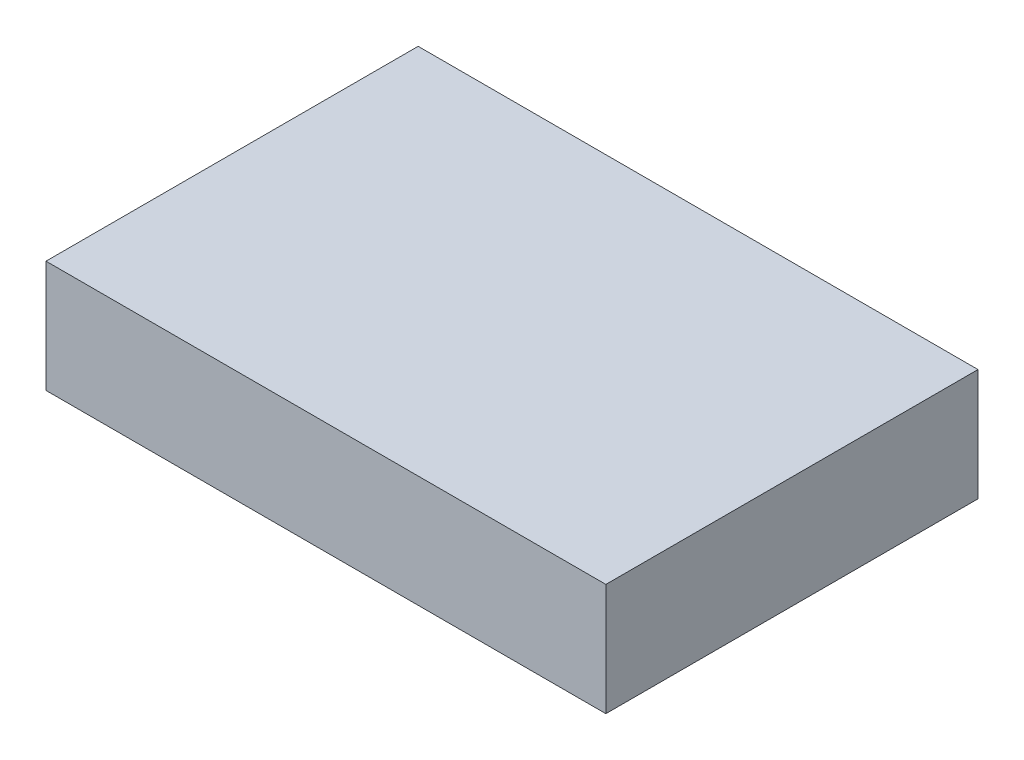
ISO-10303-21;
HEADER;
FILE_DESCRIPTION(('STEP AP214'),'2;1');
FILE_NAME('part.step','',(''),(''),'','','');
FILE_SCHEMA(('AUTOMOTIVE_DESIGN { 1 0 10303 214 1 1 1 1 }'));
ENDSEC;
DATA;
#1=APPLICATION_CONTEXT('core data for automotive mechanical design processes');
#2=APPLICATION_PROTOCOL_DEFINITION('international standard','automotive_design',2000,#1);
#3=PRODUCT_CONTEXT('',#1,'mechanical');
#4=PRODUCT('Part','Part','',(#3));
#5=PRODUCT_RELATED_PRODUCT_CATEGORY('part','',(#4));
#6=PRODUCT_DEFINITION_FORMATION('','',#4);
#7=PRODUCT_DEFINITION_CONTEXT('part definition',#1,'design');
#8=PRODUCT_DEFINITION('design','',#6,#7);
#9=PRODUCT_DEFINITION_SHAPE('','',#8);
#10=(LENGTH_UNIT() NAMED_UNIT(*) SI_UNIT(.MILLI.,.METRE.));
#11=(NAMED_UNIT(*) PLANE_ANGLE_UNIT() SI_UNIT($,.RADIAN.));
#12=(NAMED_UNIT(*) SI_UNIT($,.STERADIAN.) SOLID_ANGLE_UNIT());
#13=UNCERTAINTY_MEASURE_WITH_UNIT(LENGTH_MEASURE(1.E-05),#10,'distance_accuracy_value','');
#14=(GEOMETRIC_REPRESENTATION_CONTEXT(3) GLOBAL_UNCERTAINTY_ASSIGNED_CONTEXT((#13)) GLOBAL_UNIT_ASSIGNED_CONTEXT((#10,
#11,#12)) REPRESENTATION_CONTEXT('',''));
#15=CARTESIAN_POINT('',(0.,0.,0.));
#16=DIRECTION('',(0.,0.,1.));
#17=DIRECTION('',(1.,0.,0.));
#18=AXIS2_PLACEMENT_3D('',#15,#16,#17);
#19=CARTESIAN_POINT('',(0.,17.,0.));
#20=DIRECTION('',(-1.,0.,0.));
#21=DIRECTION('',(0.,0.,1.));
#22=AXIS2_PLACEMENT_3D('',#19,#20,#21);
#23=PLANE('',#22);
#24=DIRECTION('',(0.,0.,-1.));
#25=VECTOR('',#24,1.);
#26=CARTESIAN_POINT('',(0.,0.,0.));
#27=LINE('',#26,#25);
#28=CARTESIAN_POINT('',(0.,0.,56.5));
#29=VERTEX_POINT('',#28);
#30=CARTESIAN_POINT('',(0.,0.,0.));
#31=VERTEX_POINT('',#30);
#32=EDGE_CURVE('E113',#29,#31,#27,.T.);
#33=ORIENTED_EDGE('',*,*,#32,.T.);
#34=DIRECTION('',(0.,-1.,0.));
#35=VECTOR('',#34,1.);
#36=CARTESIAN_POINT('',(0.,17.,0.));
#37=LINE('',#36,#35);
#38=CARTESIAN_POINT('',(0.,17.,0.));
#39=VERTEX_POINT('',#38);
#40=EDGE_CURVE('E11',#39,#31,#37,.T.);
#41=ORIENTED_EDGE('',*,*,#40,.F.);
#42=DIRECTION('',(0.,0.,-1.));
#43=VECTOR('',#42,1.);
#44=CARTESIAN_POINT('',(0.,17.,0.));
#45=LINE('',#44,#43);
#46=CARTESIAN_POINT('',(0.,17.,56.5));
#47=VERTEX_POINT('',#46);
#48=EDGE_CURVE('E97',#47,#39,#45,.T.);
#49=ORIENTED_EDGE('',*,*,#48,.F.);
#50=DIRECTION('',(0.,-1.,0.));
#51=VECTOR('',#50,1.);
#52=CARTESIAN_POINT('',(0.,17.,56.5));
#53=LINE('',#52,#51);
#54=EDGE_CURVE('E109',#47,#29,#53,.T.);
#55=ORIENTED_EDGE('',*,*,#54,.T.);
#56=EDGE_LOOP('',(#33,#41,#49,#55));
#57=FACE_BOUND('',#56,.T.);
#58=ADVANCED_FACE('F45',(#57),#23,.F.);
#59=CARTESIAN_POINT('',(0.,17.,0.));
#60=DIRECTION('',(0.,0.,1.));
#61=DIRECTION('',(1.,0.,0.));
#62=AXIS2_PLACEMENT_3D('',#59,#60,#61);
#63=PLANE('',#62);
#64=DIRECTION('',(-1.,0.,0.));
#65=VECTOR('',#64,1.);
#66=CARTESIAN_POINT('',(0.,0.,0.));
#67=LINE('',#66,#65);
#68=CARTESIAN_POINT('',(-85.,0.,0.));
#69=VERTEX_POINT('',#68);
#70=EDGE_CURVE('E102',#31,#69,#67,.T.);
#71=ORIENTED_EDGE('',*,*,#70,.T.);
#72=DIRECTION('',(0.,-1.,0.));
#73=VECTOR('',#72,1.);
#74=CARTESIAN_POINT('',(-85.,17.,0.));
#75=LINE('',#74,#73);
#76=CARTESIAN_POINT('',(-85.,17.,0.));
#77=VERTEX_POINT('',#76);
#78=EDGE_CURVE('E54',#77,#69,#75,.T.);
#79=ORIENTED_EDGE('',*,*,#78,.F.);
#80=DIRECTION('',(-1.,0.,0.));
#81=VECTOR('',#80,1.);
#82=CARTESIAN_POINT('',(0.,17.,0.));
#83=LINE('',#82,#81);
#84=EDGE_CURVE('E92',#39,#77,#83,.T.);
#85=ORIENTED_EDGE('',*,*,#84,.F.);
#86=ORIENTED_EDGE('',*,*,#40,.T.);
#87=EDGE_LOOP('',(#71,#79,#85,#86));
#88=FACE_BOUND('',#87,.T.);
#89=ADVANCED_FACE('F101',(#88),#63,.F.);
#90=CARTESIAN_POINT('',(-85.,17.,0.));
#91=DIRECTION('',(1.,0.,0.));
#92=DIRECTION('',(0.,0.,-1.));
#93=AXIS2_PLACEMENT_3D('',#90,#91,#92);
#94=PLANE('',#93);
#95=DIRECTION('',(0.,0.,1.));
#96=VECTOR('',#95,1.);
#97=CARTESIAN_POINT('',(-85.,0.,0.));
#98=LINE('',#97,#96);
#99=CARTESIAN_POINT('',(-85.,0.,56.5));
#100=VERTEX_POINT('',#99);
#101=EDGE_CURVE('E79',#69,#100,#98,.T.);
#102=ORIENTED_EDGE('',*,*,#101,.T.);
#103=DIRECTION('',(0.,-1.,0.));
#104=VECTOR('',#103,1.);
#105=CARTESIAN_POINT('',(-85.,17.,56.5));
#106=LINE('',#105,#104);
#107=CARTESIAN_POINT('',(-85.,17.,56.5));
#108=VERTEX_POINT('',#107);
#109=EDGE_CURVE('E104',#108,#100,#106,.T.);
#110=ORIENTED_EDGE('',*,*,#109,.F.);
#111=DIRECTION('',(0.,0.,1.));
#112=VECTOR('',#111,1.);
#113=CARTESIAN_POINT('',(-85.,17.,0.));
#114=LINE('',#113,#112);
#115=EDGE_CURVE('E95',#77,#108,#114,.T.);
#116=ORIENTED_EDGE('',*,*,#115,.F.);
#117=ORIENTED_EDGE('',*,*,#78,.T.);
#118=EDGE_LOOP('',(#102,#110,#116,#117));
#119=FACE_BOUND('',#118,.T.);
#120=ADVANCED_FACE('F105',(#119),#94,.F.);
#121=CARTESIAN_POINT('',(0.,17.,56.5));
#122=DIRECTION('',(0.,0.,-1.));
#123=DIRECTION('',(-1.,0.,0.));
#124=AXIS2_PLACEMENT_3D('',#121,#122,#123);
#125=PLANE('',#124);
#126=DIRECTION('',(1.,0.,0.));
#127=VECTOR('',#126,1.);
#128=CARTESIAN_POINT('',(0.,0.,56.5));
#129=LINE('',#128,#127);
#130=EDGE_CURVE('E85',#100,#29,#129,.T.);
#131=ORIENTED_EDGE('',*,*,#130,.T.);
#132=ORIENTED_EDGE('',*,*,#54,.F.);
#133=DIRECTION('',(1.,0.,0.));
#134=VECTOR('',#133,1.);
#135=CARTESIAN_POINT('',(0.,17.,56.5));
#136=LINE('',#135,#134);
#137=EDGE_CURVE('E62',#108,#47,#136,.T.);
#138=ORIENTED_EDGE('',*,*,#137,.F.);
#139=ORIENTED_EDGE('',*,*,#109,.T.);
#140=EDGE_LOOP('',(#131,#132,#138,#139));
#141=FACE_BOUND('',#140,.T.);
#142=ADVANCED_FACE('F126',(#141),#125,.F.);
#143=CARTESIAN_POINT('',(0.,17.,0.));
#144=DIRECTION('',(0.,-1.,0.));
#145=DIRECTION('',(0.,0.,-1.));
#146=AXIS2_PLACEMENT_3D('',#143,#144,#145);
#147=PLANE('',#146);
#148=ORIENTED_EDGE('',*,*,#48,.T.);
#149=ORIENTED_EDGE('',*,*,#84,.T.);
#150=ORIENTED_EDGE('',*,*,#115,.T.);
#151=ORIENTED_EDGE('',*,*,#137,.T.);
#152=EDGE_LOOP('',(#148,#149,#150,#151));
#153=FACE_BOUND('',#152,.T.);
#154=ADVANCED_FACE('F93',(#153),#147,.F.);
#155=CARTESIAN_POINT('',(0.,0.,0.));
#156=DIRECTION('',(0.,-1.,0.));
#157=DIRECTION('',(0.,0.,-1.));
#158=AXIS2_PLACEMENT_3D('',#155,#156,#157);
#159=PLANE('',#158);
#160=ORIENTED_EDGE('',*,*,#32,.F.);
#161=ORIENTED_EDGE('',*,*,#130,.F.);
#162=ORIENTED_EDGE('',*,*,#101,.F.);
#163=ORIENTED_EDGE('',*,*,#70,.F.);
#164=EDGE_LOOP('',(#160,#161,#162,#163));
#165=FACE_BOUND('',#164,.T.);
#166=ADVANCED_FACE('F129',(#165),#159,.T.);
#167=CLOSED_SHELL('',(#58,#89,#120,#142,#154,#166));
#168=MANIFOLD_SOLID_BREP('B2',#167);
#169=ADVANCED_BREP_SHAPE_REPRESENTATION('',(#18,#168),#14);
#170=SHAPE_DEFINITION_REPRESENTATION(#9,#169);
ENDSEC;
END-ISO-10303-21;
